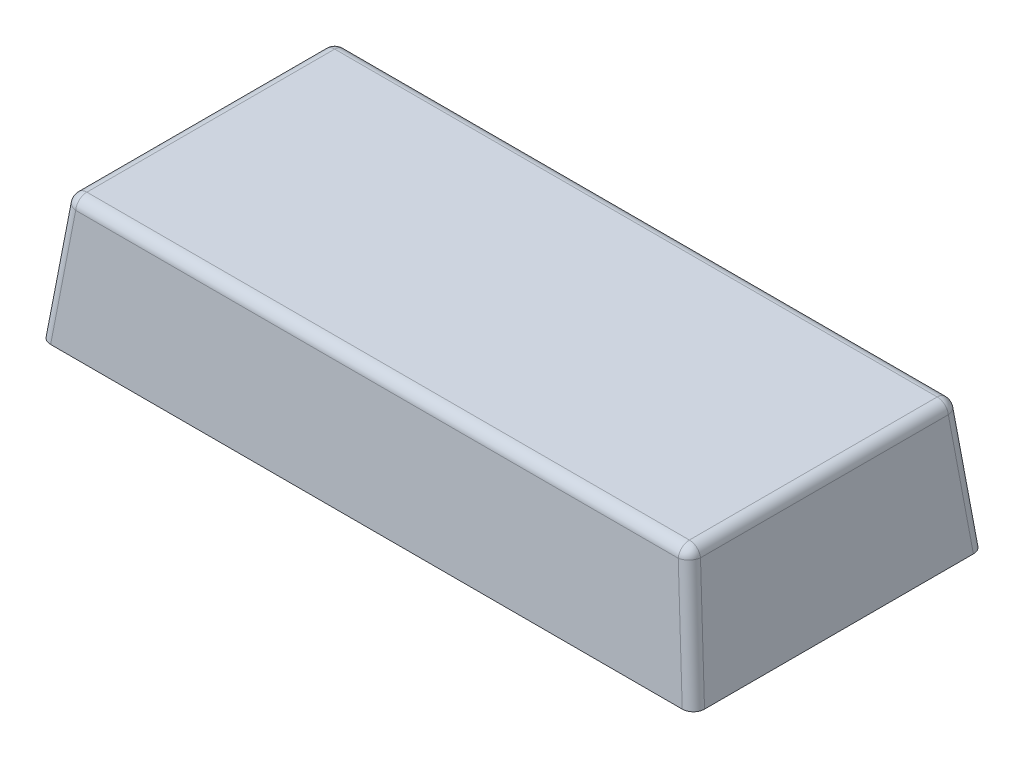
ISO-10303-21;
HEADER;
FILE_DESCRIPTION(('STEP AP214'),'2;1');
FILE_NAME('part.step','',(''),(''),'','','');
FILE_SCHEMA(('AUTOMOTIVE_DESIGN { 1 0 10303 214 1 1 1 1 }'));
ENDSEC;
DATA;
#1=APPLICATION_CONTEXT('core data for automotive mechanical design processes');
#2=APPLICATION_PROTOCOL_DEFINITION('international standard','automotive_design',2000,#1);
#3=PRODUCT_CONTEXT('',#1,'mechanical');
#4=PRODUCT('Part','Part','',(#3));
#5=PRODUCT_RELATED_PRODUCT_CATEGORY('part','',(#4));
#6=PRODUCT_DEFINITION_FORMATION('','',#4);
#7=PRODUCT_DEFINITION_CONTEXT('part definition',#1,'design');
#8=PRODUCT_DEFINITION('design','',#6,#7);
#9=PRODUCT_DEFINITION_SHAPE('','',#8);
#10=(LENGTH_UNIT() NAMED_UNIT(*) SI_UNIT(.MILLI.,.METRE.));
#11=(NAMED_UNIT(*) PLANE_ANGLE_UNIT() SI_UNIT($,.RADIAN.));
#12=(NAMED_UNIT(*) SI_UNIT($,.STERADIAN.) SOLID_ANGLE_UNIT());
#13=UNCERTAINTY_MEASURE_WITH_UNIT(LENGTH_MEASURE(1.E-05),#10,'distance_accuracy_value','');
#14=(GEOMETRIC_REPRESENTATION_CONTEXT(3) GLOBAL_UNCERTAINTY_ASSIGNED_CONTEXT((#13)) GLOBAL_UNIT_ASSIGNED_CONTEXT((#10,
#11,#12)) REPRESENTATION_CONTEXT('',''));
#15=CARTESIAN_POINT('',(0.,0.,0.));
#16=DIRECTION('',(0.,0.,1.));
#17=DIRECTION('',(1.,0.,0.));
#18=AXIS2_PLACEMENT_3D('',#15,#16,#17);
#19=CARTESIAN_POINT('',(-1.46,0.493342465753417,0.));
#20=DIRECTION('',(0.,1.,0.));
#21=DIRECTION('',(0.,0.,1.));
#22=AXIS2_PLACEMENT_3D('',#19,#20,#21);
#23=PLANE('',#22);
#24=DIRECTION('',(-1.,0.,0.));
#25=VECTOR('',#24,1.);
#26=CARTESIAN_POINT('',(-1.46,0.493342465753417,0.55326861821304));
#27=LINE('',#26,#25);
#28=CARTESIAN_POINT('',(1.34537286178868,0.493342465753417,0.55326861821304));
#29=VERTEX_POINT('',#28);
#30=CARTESIAN_POINT('',(-1.34511635608277,0.493342465753417,0.55326861821304));
#31=VERTEX_POINT('',#30);
#32=EDGE_CURVE('E128',#29,#31,#27,.T.);
#33=ORIENTED_EDGE('',*,*,#32,.F.);
#34=DIRECTION('',(0.,0.,1.));
#35=VECTOR('',#34,1.);
#36=CARTESIAN_POINT('',(1.34537286178868,0.493342465753417,0.));
#37=LINE('',#36,#35);
#38=CARTESIAN_POINT('',(1.34537286178868,0.493342465753417,-0.55326861821304));
#39=VERTEX_POINT('',#38);
#40=EDGE_CURVE('E135',#29,#39,#37,.F.);
#41=ORIENTED_EDGE('',*,*,#40,.T.);
#42=DIRECTION('',(-1.,0.,0.));
#43=VECTOR('',#42,1.);
#44=CARTESIAN_POINT('',(-1.46,0.493342465753417,-0.55326861821304));
#45=LINE('',#44,#43);
#46=CARTESIAN_POINT('',(-1.34511635608277,0.493342465753417,-0.55326861821304));
#47=VERTEX_POINT('',#46);
#48=EDGE_CURVE('E131',#47,#39,#45,.F.);
#49=ORIENTED_EDGE('',*,*,#48,.F.);
#50=DIRECTION('',(0.,0.,-1.));
#51=VECTOR('',#50,1.);
#52=CARTESIAN_POINT('',(-1.34511635608277,0.493342465753417,0.324999999999934));
#53=LINE('',#52,#51);
#54=EDGE_CURVE('E121',#31,#47,#53,.T.);
#55=ORIENTED_EDGE('',*,*,#54,.F.);
#56=EDGE_LOOP('',(#33,#41,#49,#55));
#57=FACE_BOUND('',#56,.T.);
#58=ADVANCED_FACE('F17',(#57),#23,.T.);
#59=CARTESIAN_POINT('',(1.34537286178868,0.443342465753417,0.325000000000005));
#60=DIRECTION('',(0.,0.,1.));
#61=DIRECTION('',(1.,0.,0.));
#62=AXIS2_PLACEMENT_3D('',#59,#60,#61);
#63=CYLINDRICAL_SURFACE('',#62,0.05);
#64=DIRECTION('',(0.,0.,1.));
#65=VECTOR('',#64,1.);
#66=CARTESIAN_POINT('',(1.39500016937075,0.449435932923673,0.650000000000011));
#67=LINE('',#66,#65);
#68=CARTESIAN_POINT('',(1.39500016937075,0.449435932923673,0.55326861821304));
#69=VERTEX_POINT('',#68);
#70=CARTESIAN_POINT('',(1.39500016937075,0.449435932923673,-0.55326861821304));
#71=VERTEX_POINT('',#70);
#72=EDGE_CURVE('E215',#69,#71,#67,.F.);
#73=ORIENTED_EDGE('',*,*,#72,.T.);
#74=CARTESIAN_POINT('',(1.34537286178868,0.443342465753417,-0.55326861821304));
#75=DIRECTION('',(0.,0.,-1.));
#76=DIRECTION('',(0.662620048215752,0.74895572078899,0.));
#77=AXIS2_PLACEMENT_3D('',#74,#75,#76);
#78=CIRCLE('',#77,0.05);
#79=CARTESIAN_POINT('',(1.37850386419947,0.480790251792866,-0.55326861821304));
#80=VERTEX_POINT('',#79);
#81=EDGE_CURVE('E218',#80,#71,#78,.T.);
#82=ORIENTED_EDGE('',*,*,#81,.F.);
#83=CARTESIAN_POINT('',(1.34537286178868,0.443342465753417,-0.55326861821304));
#84=DIRECTION('',(0.,0.,1.));
#85=DIRECTION('',(0.662620048215751,0.74895572078899,0.));
#86=AXIS2_PLACEMENT_3D('',#83,#84,#85);
#87=CIRCLE('',#86,0.05);
#88=EDGE_CURVE('E166',#39,#80,#87,.F.);
#89=ORIENTED_EDGE('',*,*,#88,.F.);
#90=ORIENTED_EDGE('',*,*,#40,.F.);
#91=CARTESIAN_POINT('',(1.34537286178868,0.443342465753417,0.55326861821304));
#92=DIRECTION('',(0.,0.,1.));
#93=DIRECTION('',(0.662620048215752,0.74895572078899,0.));
#94=AXIS2_PLACEMENT_3D('',#91,#92,#93);
#95=CIRCLE('',#94,0.05);
#96=CARTESIAN_POINT('',(1.37850386419947,0.480790251792866,0.55326861821304));
#97=VERTEX_POINT('',#96);
#98=EDGE_CURVE('E207',#97,#29,#95,.T.);
#99=ORIENTED_EDGE('',*,*,#98,.F.);
#100=CARTESIAN_POINT('',(1.34537286178868,0.443342465753417,0.55326861821304));
#101=DIRECTION('',(0.,0.,-1.));
#102=DIRECTION('',(0.662620048215751,0.74895572078899,0.));
#103=AXIS2_PLACEMENT_3D('',#100,#101,#102);
#104=CIRCLE('',#103,0.05);
#105=EDGE_CURVE('E209',#69,#97,#104,.F.);
#106=ORIENTED_EDGE('',*,*,#105,.F.);
#107=EDGE_LOOP('',(#73,#82,#89,#90,#99,#106));
#108=FACE_BOUND('',#107,.T.);
#109=ADVANCED_FACE('F201',(#108),#63,.T.);
#110=CARTESIAN_POINT('',(1.34537286178868,0.443342465753417,0.55326861821304));
#111=DIRECTION('',(0.662620048215751,0.74895572078899,0.));
#112=DIRECTION('',(0.74895572078899,-0.662620048215751,0.));
#113=AXIS2_PLACEMENT_3D('',#110,#111,#112);
#114=SPHERICAL_SURFACE('',#113,0.05);
#115=CARTESIAN_POINT('',(1.34537286178868,0.443342465753417,0.55326861821304));
#116=DIRECTION('',(-1.,0.,0.));
#117=DIRECTION('',(0.,0.,1.));
#118=AXIS2_PLACEMENT_3D('',#115,#116,#117);
#119=CIRCLE('',#118,0.05);
#120=CARTESIAN_POINT('',(1.34537286178868,0.447771307371025,0.603072085581549));
#121=VERTEX_POINT('',#120);
#122=EDGE_CURVE('E20',#121,#29,#119,.T.);
#123=ORIENTED_EDGE('',*,*,#122,.F.);
#124=CARTESIAN_POINT('',(1.34537286178868,0.443342465753417,0.553268618213041));
#125=DIRECTION('',(0.121397390636343,-0.988702404794772,0.0879217168833824));
#126=DIRECTION('',(0.992546151641326,0.121869343405119,0.));
#127=AXIS2_PLACEMENT_3D('',#124,#125,#126);
#128=CIRCLE('',#127,0.05);
#129=EDGE_CURVE('E160',#69,#121,#128,.T.);
#130=ORIENTED_EDGE('',*,*,#129,.F.);
#131=ORIENTED_EDGE('',*,*,#105,.T.);
#132=ORIENTED_EDGE('',*,*,#98,.T.);
#133=EDGE_LOOP('',(#123,#130,#131,#132));
#134=FACE_BOUND('',#133,.T.);
#135=ADVANCED_FACE('F198',(#134),#114,.T.);
#136=CARTESIAN_POINT('',(-1.46,0.443342465753417,0.55326861821304));
#137=DIRECTION('',(-1.,0.,0.));
#138=DIRECTION('',(0.,0.,1.));
#139=AXIS2_PLACEMENT_3D('',#136,#137,#138);
#140=CYLINDRICAL_SURFACE('',#139,0.05);
#141=DIRECTION('',(1.,0.,0.));
#142=VECTOR('',#141,1.);
#143=CARTESIAN_POINT('',(-1.46,0.447771307371025,0.603072085581549));
#144=LINE('',#143,#142);
#145=CARTESIAN_POINT('',(-1.34511635608277,0.447771307371025,0.603072085581549));
#146=VERTEX_POINT('',#145);
#147=EDGE_CURVE('E206',#121,#146,#144,.F.);
#148=ORIENTED_EDGE('',*,*,#147,.F.);
#149=ORIENTED_EDGE('',*,*,#122,.T.);
#150=ORIENTED_EDGE('',*,*,#32,.T.);
#151=CARTESIAN_POINT('',(-1.34511635608277,0.443342465753417,0.55326861821304));
#152=DIRECTION('',(-1.,0.,0.));
#153=DIRECTION('',(0.,0.,1.));
#154=AXIS2_PLACEMENT_3D('',#151,#152,#153);
#155=CIRCLE('',#154,0.05);
#156=EDGE_CURVE('E104',#146,#31,#155,.T.);
#157=ORIENTED_EDGE('',*,*,#156,.F.);
#158=EDGE_LOOP('',(#148,#149,#150,#157));
#159=FACE_BOUND('',#158,.T.);
#160=ADVANCED_FACE('F133',(#159),#140,.T.);
#161=CARTESIAN_POINT('',(-1.34511635608277,0.443342465753417,0.55326861821304));
#162=DIRECTION('',(-0.662441289686164,0.749113834953628,0.));
#163=DIRECTION('',(0.749113834953628,0.662441289686164,0.));
#164=AXIS2_PLACEMENT_3D('',#161,#162,#163);
#165=SPHERICAL_SURFACE('',#164,0.05);
#166=CARTESIAN_POINT('',(-1.34511635608278,0.443342465753417,0.55326861821304));
#167=DIRECTION('',(0.121869343405057,0.988644797500166,-0.0879165940757283));
#168=DIRECTION('',(-0.992487869896859,0.122343075437863,0.));
#169=AXIS2_PLACEMENT_3D('',#166,#167,#168);
#170=CIRCLE('',#169,0.05);
#171=CARTESIAN_POINT('',(-1.39474074957761,0.449459619525309,0.55326861821304));
#172=VERTEX_POINT('',#171);
#173=EDGE_CURVE('E110',#146,#172,#170,.F.);
#174=ORIENTED_EDGE('',*,*,#173,.F.);
#175=ORIENTED_EDGE('',*,*,#156,.T.);
#176=CARTESIAN_POINT('',(-1.34511635608277,0.443342465753417,0.55326861821304));
#177=DIRECTION('',(0.,0.,-1.));
#178=DIRECTION('',(-0.662441289686163,0.749113834953629,0.));
#179=AXIS2_PLACEMENT_3D('',#176,#177,#178);
#180=CIRCLE('',#179,0.05);
#181=CARTESIAN_POINT('',(-1.37823842056708,0.480798157501098,0.55326861821304));
#182=VERTEX_POINT('',#181);
#183=EDGE_CURVE('E107',#31,#182,#180,.F.);
#184=ORIENTED_EDGE('',*,*,#183,.T.);
#185=CARTESIAN_POINT('',(-1.34511635608277,0.443342465753417,0.55326861821304));
#186=DIRECTION('',(0.,0.,-1.));
#187=DIRECTION('',(-1.,0.,0.));
#188=AXIS2_PLACEMENT_3D('',#185,#186,#187);
#189=CIRCLE('',#188,0.05);
#190=EDGE_CURVE('E123',#172,#182,#189,.T.);
#191=ORIENTED_EDGE('',*,*,#190,.F.);
#192=EDGE_LOOP('',(#174,#175,#184,#191));
#193=FACE_BOUND('',#192,.T.);
#194=ADVANCED_FACE('F106',(#193),#165,.T.);
#195=CARTESIAN_POINT('',(-1.34511635608277,0.443342465753417,0.324999999999934));
#196=DIRECTION('',(0.,0.,-1.));
#197=DIRECTION('',(-1.,0.,0.));
#198=AXIS2_PLACEMENT_3D('',#195,#196,#197);
#199=CYLINDRICAL_SURFACE('',#198,0.05);
#200=DIRECTION('',(0.,0.,1.));
#201=VECTOR('',#200,1.);
#202=CARTESIAN_POINT('',(-1.39474074957761,0.449459619525309,0.649999999999869));
#203=LINE('',#202,#201);
#204=CARTESIAN_POINT('',(-1.39474074957761,0.449459619525309,-0.55326861821304));
#205=VERTEX_POINT('',#204);
#206=EDGE_CURVE('E158',#205,#172,#203,.T.);
#207=ORIENTED_EDGE('',*,*,#206,.T.);
#208=ORIENTED_EDGE('',*,*,#190,.T.);
#209=ORIENTED_EDGE('',*,*,#183,.F.);
#210=ORIENTED_EDGE('',*,*,#54,.T.);
#211=CARTESIAN_POINT('',(-1.34511635608277,0.443342465753417,-0.55326861821304));
#212=DIRECTION('',(0.,0.,-1.));
#213=DIRECTION('',(-0.662441289686166,0.749113834953627,0.));
#214=AXIS2_PLACEMENT_3D('',#211,#212,#213);
#215=CIRCLE('',#214,0.05);
#216=CARTESIAN_POINT('',(-1.37823842056708,0.480798157501098,-0.55326861821304));
#217=VERTEX_POINT('',#216);
#218=EDGE_CURVE('E168',#217,#47,#215,.T.);
#219=ORIENTED_EDGE('',*,*,#218,.F.);
#220=CARTESIAN_POINT('',(-1.34511635608277,0.443342465753417,-0.55326861821304));
#221=DIRECTION('',(0.,0.,1.));
#222=DIRECTION('',(-0.662441289686163,0.749113834953629,0.));
#223=AXIS2_PLACEMENT_3D('',#220,#221,#222);
#224=CIRCLE('',#223,0.05);
#225=EDGE_CURVE('E171',#205,#217,#224,.F.);
#226=ORIENTED_EDGE('',*,*,#225,.F.);
#227=EDGE_LOOP('',(#207,#208,#209,#210,#219,#226));
#228=FACE_BOUND('',#227,.T.);
#229=ADVANCED_FACE('F119',(#228),#199,.T.);
#230=CARTESIAN_POINT('',(-1.34511635608277,0.443342465753417,-0.55326861821304));
#231=DIRECTION('',(-0.662441289686164,0.749113834953628,0.));
#232=DIRECTION('',(-0.749113834953628,-0.662441289686164,0.));
#233=AXIS2_PLACEMENT_3D('',#230,#231,#232);
#234=SPHERICAL_SURFACE('',#233,0.05);
#235=CARTESIAN_POINT('',(-1.34511635608277,0.443342465753417,-0.55326861821304));
#236=DIRECTION('',(-1.,0.,0.));
#237=DIRECTION('',(0.,0.,1.));
#238=AXIS2_PLACEMENT_3D('',#235,#236,#237);
#239=CIRCLE('',#238,0.05);
#240=CARTESIAN_POINT('',(-1.34511635608277,0.447771307371025,-0.603072085581549));
#241=VERTEX_POINT('',#240);
#242=EDGE_CURVE('E167',#241,#47,#239,.F.);
#243=ORIENTED_EDGE('',*,*,#242,.F.);
#244=CARTESIAN_POINT('',(-1.34511635608277,0.443342465753416,-0.55326861821304));
#245=DIRECTION('',(-0.121869343405057,-0.988644797500166,-0.0879165940757284));
#246=DIRECTION('',(0.992487869896859,-0.122343075437863,0.));
#247=AXIS2_PLACEMENT_3D('',#244,#245,#246);
#248=CIRCLE('',#247,0.05);
#249=EDGE_CURVE('E152',#205,#241,#248,.T.);
#250=ORIENTED_EDGE('',*,*,#249,.F.);
#251=ORIENTED_EDGE('',*,*,#225,.T.);
#252=ORIENTED_EDGE('',*,*,#218,.T.);
#253=EDGE_LOOP('',(#243,#250,#251,#252));
#254=FACE_BOUND('',#253,.T.);
#255=ADVANCED_FACE('F256',(#254),#234,.T.);
#256=CARTESIAN_POINT('',(-1.46,0.443342465753417,-0.55326861821304));
#257=DIRECTION('',(-1.,0.,0.));
#258=DIRECTION('',(0.,0.,1.));
#259=AXIS2_PLACEMENT_3D('',#256,#257,#258);
#260=CYLINDRICAL_SURFACE('',#259,0.05);
#261=DIRECTION('',(1.,0.,0.));
#262=VECTOR('',#261,1.);
#263=CARTESIAN_POINT('',(-1.46,0.447771307371025,-0.603072085581549));
#264=LINE('',#263,#262);
#265=CARTESIAN_POINT('',(1.34537286178868,0.447771307371025,-0.603072085581549));
#266=VERTEX_POINT('',#265);
#267=EDGE_CURVE('E221',#241,#266,#264,.T.);
#268=ORIENTED_EDGE('',*,*,#267,.F.);
#269=ORIENTED_EDGE('',*,*,#242,.T.);
#270=ORIENTED_EDGE('',*,*,#48,.T.);
#271=CARTESIAN_POINT('',(1.34537286178868,0.443342465753417,-0.55326861821304));
#272=DIRECTION('',(-1.,0.,0.));
#273=DIRECTION('',(0.,0.,1.));
#274=AXIS2_PLACEMENT_3D('',#271,#272,#273);
#275=CIRCLE('',#274,0.05);
#276=EDGE_CURVE('E97',#266,#39,#275,.F.);
#277=ORIENTED_EDGE('',*,*,#276,.F.);
#278=EDGE_LOOP('',(#268,#269,#270,#277));
#279=FACE_BOUND('',#278,.T.);
#280=ADVANCED_FACE('F219',(#279),#260,.T.);
#281=CARTESIAN_POINT('',(1.34537286178868,0.443342465753417,-0.55326861821304));
#282=DIRECTION('',(0.662620048215751,0.74895572078899,0.));
#283=DIRECTION('',(-0.74895572078899,0.662620048215751,0.));
#284=AXIS2_PLACEMENT_3D('',#281,#282,#283);
#285=SPHERICAL_SURFACE('',#284,0.05);
#286=ORIENTED_EDGE('',*,*,#81,.T.);
#287=CARTESIAN_POINT('',(1.34537286178868,0.443342465753417,-0.55326861821304));
#288=DIRECTION('',(-0.121397390636343,0.988702404794772,0.0879217168833824));
#289=DIRECTION('',(-0.992546151641326,-0.121869343405119,0.));
#290=AXIS2_PLACEMENT_3D('',#287,#288,#289);
#291=CIRCLE('',#290,0.05);
#292=EDGE_CURVE('E149',#266,#71,#291,.F.);
#293=ORIENTED_EDGE('',*,*,#292,.F.);
#294=ORIENTED_EDGE('',*,*,#276,.T.);
#295=ORIENTED_EDGE('',*,*,#88,.T.);
#296=EDGE_LOOP('',(#286,#293,#294,#295));
#297=FACE_BOUND('',#296,.T.);
#298=ADVANCED_FACE('F249',(#297),#285,.T.);
#299=CARTESIAN_POINT('',(1.41892769485967,0.254561876177647,0.650000000000011));
#300=DIRECTION('',(-0.992546151641326,-0.121869343405119,0.));
#301=DIRECTION('',(0.121869343405119,-0.992546151641326,0.));
#302=AXIS2_PLACEMENT_3D('',#299,#300,#301);
#303=PLANE('',#302);
#304=ORIENTED_EDGE('',*,*,#72,.F.);
#305=DIRECTION('',(0.121397390636343,-0.988702404794772,0.0879217168833824));
#306=VECTOR('',#305,1.);
#307=CARTESIAN_POINT('',(1.40129772021796,0.398146497176215,0.557829601606049));
#308=LINE('',#307,#306);
#309=CARTESIAN_POINT('',(1.45999999999988,-0.0799452054794647,0.600344561741007));
#310=VERTEX_POINT('',#309);
#311=EDGE_CURVE('E164',#310,#69,#308,.F.);
#312=ORIENTED_EDGE('',*,*,#311,.F.);
#313=DIRECTION('',(0.,0.,-1.));
#314=VECTOR('',#313,1.);
#315=CARTESIAN_POINT('',(1.46,-0.0799452054794599,0.));
#316=LINE('',#315,#314);
#317=CARTESIAN_POINT('',(1.45999999999988,-0.0799452054794647,-0.600344561741007));
#318=VERTEX_POINT('',#317);
#319=EDGE_CURVE('E147',#318,#310,#316,.F.);
#320=ORIENTED_EDGE('',*,*,#319,.F.);
#321=DIRECTION('',(0.121397390636343,-0.988702404794772,-0.0879217168833832));
#322=VECTOR('',#321,1.);
#323=CARTESIAN_POINT('',(1.39500016937075,0.449435932923673,-0.55326861821304));
#324=LINE('',#323,#322);
#325=EDGE_CURVE('E217',#71,#318,#324,.T.);
#326=ORIENTED_EDGE('',*,*,#325,.F.);
#327=EDGE_LOOP('',(#304,#312,#320,#326));
#328=FACE_BOUND('',#327,.T.);
#329=ADVANCED_FACE('F253',(#328),#303,.F.);
#330=CARTESIAN_POINT('',(1.35167041263589,0.392053030005959,0.557829601606049));
#331=DIRECTION('',(0.121397390636343,-0.988702404794772,0.0879217168833824));
#332=DIRECTION('',(0.992546151641326,0.121869343405119,0.));
#333=AXIS2_PLACEMENT_3D('',#330,#331,#332);
#334=CYLINDRICAL_SURFACE('',#333,0.05);
#335=DIRECTION('',(-0.121397390636337,0.988702404794773,-0.0879217168833825));
#336=VECTOR('',#335,1.);
#337=CARTESIAN_POINT('',(1.41016830210022,-0.0799452054794599,0.65));
#338=LINE('',#337,#336);
#339=CARTESIAN_POINT('',(1.41016830210022,-0.0799452054794599,0.650000000000001));
#340=VERTEX_POINT('',#339);
#341=EDGE_CURVE('E163',#340,#121,#338,.T.);
#342=ORIENTED_EDGE('',*,*,#341,.F.);
#343=CARTESIAN_POINT('',(1.4096245087269,-0.0799452054794599,0.599802691818588));
#344=DIRECTION('',(0.,-1.,0.));
#345=DIRECTION('',(0.809900090650569,0.,0.586567850435225));
#346=AXIS2_PLACEMENT_3D('',#343,#344,#345);
#347=ELLIPSE('',#346,0.0505713344657826,0.05);
#348=EDGE_CURVE('E145',#310,#340,#347,.T.);
#349=ORIENTED_EDGE('',*,*,#348,.F.);
#350=ORIENTED_EDGE('',*,*,#311,.T.);
#351=ORIENTED_EDGE('',*,*,#129,.T.);
#352=EDGE_LOOP('',(#342,#349,#350,#351));
#353=FACE_BOUND('',#352,.T.);
#354=ADVANCED_FACE('F287',(#353),#334,.T.);
#355=CARTESIAN_POINT('',(-1.46,0.206698630136979,0.624509803921569));
#356=DIRECTION('',(0.,0.0885768323521725,0.996069347370179));
#357=DIRECTION('',(0.,-0.996069347370179,0.0885768323521725));
#358=AXIS2_PLACEMENT_3D('',#355,#356,#357);
#359=PLANE('',#358);
#360=ORIENTED_EDGE('',*,*,#341,.T.);
#361=ORIENTED_EDGE('',*,*,#147,.T.);
#362=DIRECTION('',(0.121869343405057,0.988644797500166,-0.0879165940757283));
#363=VECTOR('',#362,1.);
#364=CARTESIAN_POINT('',(-1.37316182013388,0.220257140535454,0.62330409479531));
#365=LINE('',#364,#363);
#366=CARTESIAN_POINT('',(-1.41016748980412,-0.0799452054794599,0.65));
#367=VERTEX_POINT('',#366);
#368=EDGE_CURVE('E159',#367,#146,#365,.T.);
#369=ORIENTED_EDGE('',*,*,#368,.F.);
#370=DIRECTION('',(1.,0.,0.));
#371=VECTOR('',#370,1.);
#372=CARTESIAN_POINT('',(-1.46,-0.0799452054794599,0.65));
#373=LINE('',#372,#371);
#374=EDGE_CURVE('E144',#340,#367,#373,.F.);
#375=ORIENTED_EDGE('',*,*,#374,.F.);
#376=EDGE_LOOP('',(#360,#361,#369,#375));
#377=FACE_BOUND('',#376,.T.);
#378=ADVANCED_FACE('F284',(#377),#359,.T.);
#379=CARTESIAN_POINT('',(-1.37316182013388,0.215828298917846,0.573500627426801));
#380=DIRECTION('',(0.121869343405057,0.988644797500166,-0.0879165940757283));
#381=DIRECTION('',(-0.992487869896859,0.122343075437863,0.));
#382=AXIS2_PLACEMENT_3D('',#379,#380,#381);
#383=CYLINDRICAL_SURFACE('',#382,0.05);
#384=DIRECTION('',(-0.121869343405058,-0.988644797500166,0.0879165940757282));
#385=VECTOR('',#384,1.);
#386=CARTESIAN_POINT('',(-1.39474074957761,0.449459619525309,0.55326861821304));
#387=LINE('',#386,#385);
#388=CARTESIAN_POINT('',(-1.45999999999996,-0.0799452054794615,0.600346668104532));
#389=VERTEX_POINT('',#388);
#390=EDGE_CURVE('E185',#172,#389,#387,.T.);
#391=ORIENTED_EDGE('',*,*,#390,.T.);
#392=CARTESIAN_POINT('',(-1.40962155053317,-0.0799452054794599,0.599802691818587));
#393=DIRECTION('',(0.,-1.,0.));
#394=DIRECTION('',(0.81099545502977,0.,-0.585052452281894));
#395=AXIS2_PLACEMENT_3D('',#392,#393,#394);
#396=ELLIPSE('',#395,0.050574281204359,0.05);
#397=EDGE_CURVE('E142',#367,#389,#396,.T.);
#398=ORIENTED_EDGE('',*,*,#397,.F.);
#399=ORIENTED_EDGE('',*,*,#368,.T.);
#400=ORIENTED_EDGE('',*,*,#173,.T.);
#401=EDGE_LOOP('',(#391,#398,#399,#400));
#402=FACE_BOUND('',#401,.T.);
#403=ADVANCED_FACE('F280',(#402),#383,.T.);
#404=CARTESIAN_POINT('',(-1.41900106214219,0.252651865150384,0.649999999999869));
#405=DIRECTION('',(0.992487869896859,-0.122343075437864,0.));
#406=DIRECTION('',(0.122343075437864,0.992487869896859,0.));
#407=AXIS2_PLACEMENT_3D('',#404,#405,#406);
#408=PLANE('',#407);
#409=DIRECTION('',(0.,0.,-1.));
#410=VECTOR('',#409,1.);
#411=CARTESIAN_POINT('',(-1.46,-0.0799452054794599,0.));
#412=LINE('',#411,#410);
#413=CARTESIAN_POINT('',(-1.45999999999996,-0.0799452054794616,-0.600346668104532));
#414=VERTEX_POINT('',#413);
#415=EDGE_CURVE('E141',#389,#414,#412,.T.);
#416=ORIENTED_EDGE('',*,*,#415,.F.);
#417=ORIENTED_EDGE('',*,*,#390,.F.);
#418=ORIENTED_EDGE('',*,*,#206,.F.);
#419=DIRECTION('',(-0.121869343405057,-0.988644797500166,-0.0879165940757284));
#420=VECTOR('',#419,1.);
#421=CARTESIAN_POINT('',(-1.41582189419234,0.278442336865215,-0.568476564542782));
#422=LINE('',#421,#420);
#423=EDGE_CURVE('E156',#414,#205,#422,.F.);
#424=ORIENTED_EDGE('',*,*,#423,.F.);
#425=EDGE_LOOP('',(#416,#417,#418,#424));
#426=FACE_BOUND('',#425,.T.);
#427=ADVANCED_FACE('F276',(#426),#408,.F.);
#428=CARTESIAN_POINT('',(-1.3661975006975,0.272325183093322,-0.568476564542783));
#429=DIRECTION('',(-0.121869343405057,-0.988644797500166,-0.0879165940757284));
#430=DIRECTION('',(0.992487869896859,-0.122343075437863,0.));
#431=AXIS2_PLACEMENT_3D('',#428,#429,#430);
#432=CYLINDRICAL_SURFACE('',#431,0.05);
#433=DIRECTION('',(0.121869343405067,0.988644797500165,0.0879165940757284));
#434=VECTOR('',#433,1.);
#435=CARTESIAN_POINT('',(-1.41016748980412,-0.0799452054794599,-0.65));
#436=LINE('',#435,#434);
#437=CARTESIAN_POINT('',(-1.41016748980412,-0.0799452054794599,-0.65));
#438=VERTEX_POINT('',#437);
#439=EDGE_CURVE('E155',#438,#241,#436,.T.);
#440=ORIENTED_EDGE('',*,*,#439,.F.);
#441=CARTESIAN_POINT('',(-1.40962155053316,-0.0799452054794599,-0.599802691818588));
#442=DIRECTION('',(0.,-1.,0.));
#443=DIRECTION('',(-0.810995455029769,0.,-0.585052452281894));
#444=AXIS2_PLACEMENT_3D('',#441,#442,#443);
#445=ELLIPSE('',#444,0.050574281204359,0.05);
#446=EDGE_CURVE('E26',#414,#438,#445,.T.);
#447=ORIENTED_EDGE('',*,*,#446,.F.);
#448=ORIENTED_EDGE('',*,*,#423,.T.);
#449=ORIENTED_EDGE('',*,*,#249,.T.);
#450=EDGE_LOOP('',(#440,#447,#448,#449));
#451=FACE_BOUND('',#450,.T.);
#452=ADVANCED_FACE('F273',(#451),#432,.T.);
#453=CARTESIAN_POINT('',(-1.46,0.206698630136978,-0.624509803921569));
#454=DIRECTION('',(0.,0.0885768323521725,-0.996069347370179));
#455=DIRECTION('',(0.,0.996069347370179,0.0885768323521725));
#456=AXIS2_PLACEMENT_3D('',#453,#454,#455);
#457=PLANE('',#456);
#458=ORIENTED_EDGE('',*,*,#439,.T.);
#459=ORIENTED_EDGE('',*,*,#267,.T.);
#460=DIRECTION('',(-0.121397390636343,0.988702404794772,0.0879217168833824));
#461=VECTOR('',#460,1.);
#462=CARTESIAN_POINT('',(1.34473265907944,0.452985340019153,-0.602608420579738));
#463=LINE('',#462,#461);
#464=CARTESIAN_POINT('',(1.41016830210022,-0.0799452054794599,-0.65));
#465=VERTEX_POINT('',#464);
#466=EDGE_CURVE('E151',#465,#266,#463,.T.);
#467=ORIENTED_EDGE('',*,*,#466,.F.);
#468=DIRECTION('',(1.,0.,0.));
#469=VECTOR('',#468,1.);
#470=CARTESIAN_POINT('',(-1.46,-0.0799452054794599,-0.65));
#471=LINE('',#470,#469);
#472=EDGE_CURVE('E11',#438,#465,#471,.T.);
#473=ORIENTED_EDGE('',*,*,#472,.F.);
#474=EDGE_LOOP('',(#458,#459,#467,#473));
#475=FACE_BOUND('',#474,.T.);
#476=ADVANCED_FACE('F224',(#475),#457,.T.);
#477=CARTESIAN_POINT('',(1.34473265907945,0.448556498401545,-0.552804953211229));
#478=DIRECTION('',(-0.121397390636343,0.988702404794772,0.0879217168833824));
#479=DIRECTION('',(-0.992546151641326,-0.121869343405119,0.));
#480=AXIS2_PLACEMENT_3D('',#477,#478,#479);
#481=CYLINDRICAL_SURFACE('',#480,0.05);
#482=ORIENTED_EDGE('',*,*,#466,.T.);
#483=ORIENTED_EDGE('',*,*,#292,.T.);
#484=ORIENTED_EDGE('',*,*,#325,.T.);
#485=CARTESIAN_POINT('',(1.4096245087269,-0.0799452054794599,-0.599802691818587));
#486=DIRECTION('',(0.,-1.,0.));
#487=DIRECTION('',(-0.809900090650569,0.,0.586567850435225));
#488=AXIS2_PLACEMENT_3D('',#485,#486,#487);
#489=ELLIPSE('',#488,0.0505713344657826,0.05);
#490=EDGE_CURVE('E35',#465,#318,#489,.T.);
#491=ORIENTED_EDGE('',*,*,#490,.F.);
#492=EDGE_LOOP('',(#482,#483,#484,#491));
#493=FACE_BOUND('',#492,.T.);
#494=ADVANCED_FACE('F227',(#493),#481,.T.);
#495=CARTESIAN_POINT('',(-1.46,-0.0799452054794599,0.));
#496=DIRECTION('',(0.,-1.,0.));
#497=DIRECTION('',(0.,0.,-1.));
#498=AXIS2_PLACEMENT_3D('',#495,#496,#497);
#499=PLANE('',#498);
#500=ORIENTED_EDGE('',*,*,#472,.T.);
#501=ORIENTED_EDGE('',*,*,#490,.T.);
#502=ORIENTED_EDGE('',*,*,#319,.T.);
#503=ORIENTED_EDGE('',*,*,#348,.T.);
#504=ORIENTED_EDGE('',*,*,#374,.T.);
#505=ORIENTED_EDGE('',*,*,#397,.T.);
#506=ORIENTED_EDGE('',*,*,#415,.T.);
#507=ORIENTED_EDGE('',*,*,#446,.T.);
#508=EDGE_LOOP('',(#500,#501,#502,#503,#504,#505,#506,#507));
#509=FACE_BOUND('',#508,.T.);
#510=ADVANCED_FACE('F262',(#509),#499,.T.);
#511=CLOSED_SHELL('',(#58,#109,#135,#160,#194,#229,#255,#280,#298,#329,#354,#378,#403,#427,#452,
#476,#494,#510));
#512=MANIFOLD_SOLID_BREP('B1',#511);
#513=ADVANCED_BREP_SHAPE_REPRESENTATION('',(#18,#512),#14);
#514=SHAPE_DEFINITION_REPRESENTATION(#9,#513);
ENDSEC;
END-ISO-10303-21;
